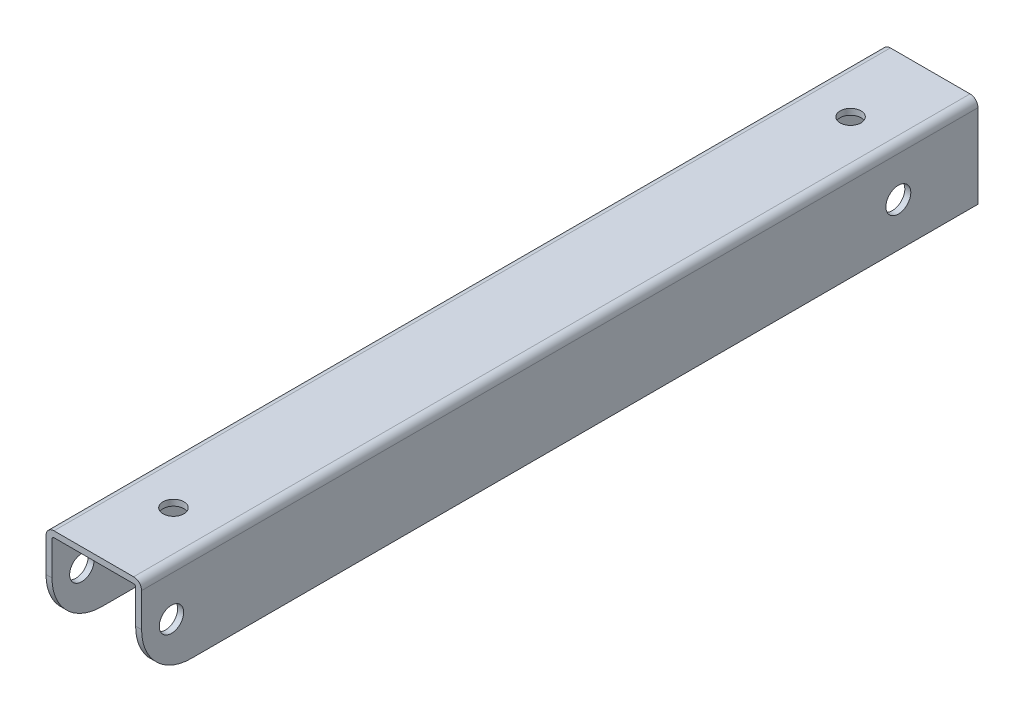
ISO-10303-21;
HEADER;
FILE_DESCRIPTION(('STEP AP214'),'2;1');
FILE_NAME('part.step','',(''),(''),'','','');
FILE_SCHEMA(('AUTOMOTIVE_DESIGN { 1 0 10303 214 1 1 1 1 }'));
ENDSEC;
DATA;
#1=APPLICATION_CONTEXT('core data for automotive mechanical design processes');
#2=APPLICATION_PROTOCOL_DEFINITION('international standard','automotive_design',2000,#1);
#3=PRODUCT_CONTEXT('',#1,'mechanical');
#4=PRODUCT('Part','Part','',(#3));
#5=PRODUCT_RELATED_PRODUCT_CATEGORY('part','',(#4));
#6=PRODUCT_DEFINITION_FORMATION('','',#4);
#7=PRODUCT_DEFINITION_CONTEXT('part definition',#1,'design');
#8=PRODUCT_DEFINITION('design','',#6,#7);
#9=PRODUCT_DEFINITION_SHAPE('','',#8);
#10=(LENGTH_UNIT() NAMED_UNIT(*) SI_UNIT(.MILLI.,.METRE.));
#11=(NAMED_UNIT(*) PLANE_ANGLE_UNIT() SI_UNIT($,.RADIAN.));
#12=(NAMED_UNIT(*) SI_UNIT($,.STERADIAN.) SOLID_ANGLE_UNIT());
#13=UNCERTAINTY_MEASURE_WITH_UNIT(LENGTH_MEASURE(1.E-05),#10,'distance_accuracy_value','');
#14=(GEOMETRIC_REPRESENTATION_CONTEXT(3) GLOBAL_UNCERTAINTY_ASSIGNED_CONTEXT((#13)) GLOBAL_UNIT_ASSIGNED_CONTEXT((#10,
#11,#12)) REPRESENTATION_CONTEXT('',''));
#15=CARTESIAN_POINT('',(0.,0.,0.));
#16=DIRECTION('',(0.,0.,1.));
#17=DIRECTION('',(1.,0.,0.));
#18=AXIS2_PLACEMENT_3D('',#15,#16,#17);
#19=CARTESIAN_POINT('',(-40.044551645857,40.375,420.));
#20=DIRECTION('',(1.,0.,0.));
#21=DIRECTION('',(0.,1.,0.));
#22=AXIS2_PLACEMENT_3D('',#19,#20,#21);
#23=PLANE('',#22);
#24=CARTESIAN_POINT('',(-40.0445516458568,20.375,405.));
#25=DIRECTION('',(-1.,0.,0.));
#26=DIRECTION('',(0.,0.,1.));
#27=AXIS2_PLACEMENT_3D('',#24,#25,#26);
#28=CIRCLE('',#27,6.12499999999999);
#29=CARTESIAN_POINT('',(-40.0445516458568,20.375,411.125));
#30=VERTEX_POINT('',#29);
#31=EDGE_CURVE('E404',#30,#30,#28,.T.);
#32=ORIENTED_EDGE('',*,*,#31,.F.);
#33=EDGE_LOOP('',(#32));
#34=FACE_BOUND('',#33,.T.);
#35=CARTESIAN_POINT('',(-40.0445516458568,20.375,40.));
#36=DIRECTION('',(-1.,0.,0.));
#37=DIRECTION('',(0.,0.,1.));
#38=AXIS2_PLACEMENT_3D('',#35,#36,#37);
#39=CIRCLE('',#38,6.25);
#40=CARTESIAN_POINT('',(-40.0445516458568,20.375,46.25));
#41=VERTEX_POINT('',#40);
#42=EDGE_CURVE('E420',#41,#41,#39,.T.);
#43=ORIENTED_EDGE('',*,*,#42,.F.);
#44=EDGE_LOOP('',(#43));
#45=FACE_BOUND('',#44,.T.);
#46=DIRECTION('',(0.,0.,-1.));
#47=VECTOR('',#46,1.);
#48=CARTESIAN_POINT('',(-40.0445516458566,-1.62500000000004,420.));
#49=LINE('',#48,#47);
#50=CARTESIAN_POINT('',(-40.0445516458566,-1.62500000000004,395.));
#51=VERTEX_POINT('',#50);
#52=CARTESIAN_POINT('',(-40.0445516458566,-1.62500000000004,0.));
#53=VERTEX_POINT('',#52);
#54=EDGE_CURVE('E265',#51,#53,#49,.T.);
#55=ORIENTED_EDGE('',*,*,#54,.F.);
#56=CARTESIAN_POINT('',(-40.0445516458568,23.375,395.));
#57=DIRECTION('',(1.,0.,0.));
#58=DIRECTION('',(0.,1.,0.));
#59=AXIS2_PLACEMENT_3D('',#56,#57,#58);
#60=CIRCLE('',#59,25.);
#61=CARTESIAN_POINT('',(-40.0445516458568,23.375,420.));
#62=VERTEX_POINT('',#61);
#63=EDGE_CURVE('E272',#51,#62,#60,.F.);
#64=ORIENTED_EDGE('',*,*,#63,.T.);
#65=DIRECTION('',(0.,-1.,0.));
#66=VECTOR('',#65,1.);
#67=CARTESIAN_POINT('',(-40.044551645857,40.375,420.));
#68=LINE('',#67,#66);
#69=CARTESIAN_POINT('',(-40.044551645857,40.375,420.));
#70=VERTEX_POINT('',#69);
#71=EDGE_CURVE('E162',#70,#62,#68,.T.);
#72=ORIENTED_EDGE('',*,*,#71,.F.);
#73=DIRECTION('',(0.,0.,-1.));
#74=VECTOR('',#73,1.);
#75=CARTESIAN_POINT('',(-40.044551645857,40.375,420.));
#76=LINE('',#75,#74);
#77=CARTESIAN_POINT('',(-40.044551645857,40.375,0.));
#78=VERTEX_POINT('',#77);
#79=EDGE_CURVE('E191',#70,#78,#76,.T.);
#80=ORIENTED_EDGE('',*,*,#79,.T.);
#81=DIRECTION('',(0.,-1.,0.));
#82=VECTOR('',#81,1.);
#83=CARTESIAN_POINT('',(-40.044551645857,40.375,0.));
#84=LINE('',#83,#82);
#85=EDGE_CURVE('E192',#78,#53,#84,.T.);
#86=ORIENTED_EDGE('',*,*,#85,.T.);
#87=EDGE_LOOP('',(#55,#64,#72,#80,#86));
#88=FACE_BOUND('',#87,.T.);
#89=ADVANCED_FACE('F38',(#34,#45,#88),#23,.F.);
#90=CARTESIAN_POINT('',(-37.0445516458566,-1.62500000000001,420.));
#91=DIRECTION('',(0.,-1.,0.));
#92=DIRECTION('',(1.,0.,0.));
#93=AXIS2_PLACEMENT_3D('',#90,#91,#92);
#94=PLANE('',#93);
#95=DIRECTION('',(0.,0.,-1.));
#96=VECTOR('',#95,1.);
#97=CARTESIAN_POINT('',(-37.0445516458566,-1.62500000000001,420.));
#98=LINE('',#97,#96);
#99=CARTESIAN_POINT('',(-37.0445516458566,-1.62500000000001,395.));
#100=VERTEX_POINT('',#99);
#101=CARTESIAN_POINT('',(-37.0445516458566,-1.62500000000001,0.));
#102=VERTEX_POINT('',#101);
#103=EDGE_CURVE('E150',#100,#102,#98,.T.);
#104=ORIENTED_EDGE('',*,*,#103,.F.);
#105=DIRECTION('',(-1.,0.,0.));
#106=VECTOR('',#105,1.);
#107=CARTESIAN_POINT('',(-37.0445516458566,-1.62500000000001,395.));
#108=LINE('',#107,#106);
#109=EDGE_CURVE('E268',#100,#51,#108,.T.);
#110=ORIENTED_EDGE('',*,*,#109,.T.);
#111=ORIENTED_EDGE('',*,*,#54,.T.);
#112=DIRECTION('',(-1.,0.,0.));
#113=VECTOR('',#112,1.);
#114=CARTESIAN_POINT('',(-37.0445516458566,-1.62500000000001,0.));
#115=LINE('',#114,#113);
#116=EDGE_CURVE('E196',#102,#53,#115,.T.);
#117=ORIENTED_EDGE('',*,*,#116,.F.);
#118=EDGE_LOOP('',(#104,#110,#111,#117));
#119=FACE_BOUND('',#118,.T.);
#120=ADVANCED_FACE('F320',(#119),#94,.T.);
#121=CARTESIAN_POINT('',(-37.044551645857,40.375,420.));
#122=DIRECTION('',(1.,0.,0.));
#123=DIRECTION('',(0.,1.,0.));
#124=AXIS2_PLACEMENT_3D('',#121,#122,#123);
#125=PLANE('',#124);
#126=CARTESIAN_POINT('',(-37.0445516458568,20.375,405.));
#127=DIRECTION('',(1.,0.,0.));
#128=DIRECTION('',(0.,1.,0.));
#129=AXIS2_PLACEMENT_3D('',#126,#127,#128);
#130=CIRCLE('',#129,6.12499999999999);
#131=CARTESIAN_POINT('',(-37.0445516458568,26.4999999999999,405.));
#132=VERTEX_POINT('',#131);
#133=EDGE_CURVE('E416',#132,#132,#130,.T.);
#134=ORIENTED_EDGE('',*,*,#133,.F.);
#135=EDGE_LOOP('',(#134));
#136=FACE_BOUND('',#135,.T.);
#137=CARTESIAN_POINT('',(-37.0445516458568,20.375,40.));
#138=DIRECTION('',(1.,0.,0.));
#139=DIRECTION('',(0.,1.,0.));
#140=AXIS2_PLACEMENT_3D('',#137,#138,#139);
#141=CIRCLE('',#140,6.24999999999999);
#142=CARTESIAN_POINT('',(-37.0445516458568,26.6249999999999,40.));
#143=VERTEX_POINT('',#142);
#144=EDGE_CURVE('E428',#143,#143,#141,.T.);
#145=ORIENTED_EDGE('',*,*,#144,.F.);
#146=EDGE_LOOP('',(#145));
#147=FACE_BOUND('',#146,.T.);
#148=DIRECTION('',(0.,-1.,0.));
#149=VECTOR('',#148,1.);
#150=CARTESIAN_POINT('',(-37.044551645857,40.375,420.));
#151=LINE('',#150,#149);
#152=CARTESIAN_POINT('',(-37.044551645857,40.375,420.));
#153=VERTEX_POINT('',#152);
#154=CARTESIAN_POINT('',(-37.0445516458568,23.375,420.));
#155=VERTEX_POINT('',#154);
#156=EDGE_CURVE('E141',#153,#155,#151,.T.);
#157=ORIENTED_EDGE('',*,*,#156,.T.);
#158=CARTESIAN_POINT('',(-37.0445516458568,23.375,395.));
#159=DIRECTION('',(1.,0.,0.));
#160=DIRECTION('',(0.,1.,0.));
#161=AXIS2_PLACEMENT_3D('',#158,#159,#160);
#162=CIRCLE('',#161,25.);
#163=EDGE_CURVE('E277',#155,#100,#162,.T.);
#164=ORIENTED_EDGE('',*,*,#163,.T.);
#165=ORIENTED_EDGE('',*,*,#103,.T.);
#166=DIRECTION('',(0.,-1.,0.));
#167=VECTOR('',#166,1.);
#168=CARTESIAN_POINT('',(-37.044551645857,40.375,0.));
#169=LINE('',#168,#167);
#170=CARTESIAN_POINT('',(-37.044551645857,40.375,0.));
#171=VERTEX_POINT('',#170);
#172=EDGE_CURVE('E144',#171,#102,#169,.T.);
#173=ORIENTED_EDGE('',*,*,#172,.F.);
#174=DIRECTION('',(0.,0.,-1.));
#175=VECTOR('',#174,1.);
#176=CARTESIAN_POINT('',(-37.044551645857,40.375,420.));
#177=LINE('',#176,#175);
#178=EDGE_CURVE('E138',#153,#171,#177,.T.);
#179=ORIENTED_EDGE('',*,*,#178,.F.);
#180=EDGE_LOOP('',(#157,#164,#165,#173,#179));
#181=FACE_BOUND('',#180,.T.);
#182=ADVANCED_FACE('F140',(#136,#147,#181),#125,.T.);
#183=CARTESIAN_POINT('',(-36.044551645857,40.375,420.));
#184=DIRECTION('',(0.,0.,-1.));
#185=DIRECTION('',(-1.,0.,0.));
#186=AXIS2_PLACEMENT_3D('',#183,#184,#185);
#187=CYLINDRICAL_SURFACE('',#186,1.);
#188=CARTESIAN_POINT('',(-36.044551645857,40.375,0.));
#189=DIRECTION('',(0.,0.,1.));
#190=DIRECTION('',(1.,0.,0.));
#191=AXIS2_PLACEMENT_3D('',#188,#189,#190);
#192=CIRCLE('',#191,1.);
#193=CARTESIAN_POINT('',(-36.044551645857,41.375,0.));
#194=VERTEX_POINT('',#193);
#195=EDGE_CURVE('E203',#194,#171,#192,.T.);
#196=ORIENTED_EDGE('',*,*,#195,.F.);
#197=DIRECTION('',(0.,0.,-1.));
#198=VECTOR('',#197,1.);
#199=CARTESIAN_POINT('',(-36.044551645857,41.375,420.));
#200=LINE('',#199,#198);
#201=CARTESIAN_POINT('',(-36.044551645857,41.375,420.));
#202=VERTEX_POINT('',#201);
#203=EDGE_CURVE('E151',#202,#194,#200,.T.);
#204=ORIENTED_EDGE('',*,*,#203,.F.);
#205=CARTESIAN_POINT('',(-36.044551645857,40.375,420.));
#206=DIRECTION('',(0.,0.,1.));
#207=DIRECTION('',(1.,0.,0.));
#208=AXIS2_PLACEMENT_3D('',#205,#206,#207);
#209=CIRCLE('',#208,1.);
#210=EDGE_CURVE('E156',#202,#153,#209,.T.);
#211=ORIENTED_EDGE('',*,*,#210,.T.);
#212=ORIENTED_EDGE('',*,*,#178,.T.);
#213=EDGE_LOOP('',(#196,#204,#211,#212));
#214=FACE_BOUND('',#213,.T.);
#215=ADVANCED_FACE('F164',(#214),#187,.F.);
#216=CARTESIAN_POINT('',(-36.044551645857,41.375,420.));
#217=DIRECTION('',(0.,-1.,0.));
#218=DIRECTION('',(0.,0.,-1.));
#219=AXIS2_PLACEMENT_3D('',#216,#217,#218);
#220=PLANE('',#219);
#221=CARTESIAN_POINT('',(-16.044551645857,41.375,380.));
#222=DIRECTION('',(0.,-1.,0.));
#223=DIRECTION('',(0.,0.,-1.));
#224=AXIS2_PLACEMENT_3D('',#221,#222,#223);
#225=CIRCLE('',#224,5.24999999999999);
#226=CARTESIAN_POINT('',(-16.044551645857,41.375,374.75));
#227=VERTEX_POINT('',#226);
#228=EDGE_CURVE('E387',#227,#227,#225,.T.);
#229=ORIENTED_EDGE('',*,*,#228,.F.);
#230=EDGE_LOOP('',(#229));
#231=FACE_BOUND('',#230,.T.);
#232=CARTESIAN_POINT('',(-16.044551645857,41.375,40.));
#233=DIRECTION('',(0.,-1.,0.));
#234=DIRECTION('',(0.,0.,-1.));
#235=AXIS2_PLACEMENT_3D('',#232,#233,#234);
#236=CIRCLE('',#235,5.24999999999999);
#237=CARTESIAN_POINT('',(-16.044551645857,41.375,34.75));
#238=VERTEX_POINT('',#237);
#239=EDGE_CURVE('E400',#238,#238,#236,.T.);
#240=ORIENTED_EDGE('',*,*,#239,.F.);
#241=EDGE_LOOP('',(#240));
#242=FACE_BOUND('',#241,.T.);
#243=DIRECTION('',(-1.,0.,0.));
#244=VECTOR('',#243,1.);
#245=CARTESIAN_POINT('',(-36.044551645857,41.375,0.));
#246=LINE('',#245,#244);
#247=CARTESIAN_POINT('',(3.95544835414302,41.375,0.));
#248=VERTEX_POINT('',#247);
#249=EDGE_CURVE('E206',#248,#194,#246,.T.);
#250=ORIENTED_EDGE('',*,*,#249,.F.);
#251=DIRECTION('',(0.,0.,-1.));
#252=VECTOR('',#251,1.);
#253=CARTESIAN_POINT('',(3.95544835414302,41.375,420.));
#254=LINE('',#253,#252);
#255=CARTESIAN_POINT('',(3.95544835414302,41.375,420.));
#256=VERTEX_POINT('',#255);
#257=EDGE_CURVE('E258',#256,#248,#254,.T.);
#258=ORIENTED_EDGE('',*,*,#257,.F.);
#259=DIRECTION('',(-1.,0.,0.));
#260=VECTOR('',#259,1.);
#261=CARTESIAN_POINT('',(-36.044551645857,41.375,420.));
#262=LINE('',#261,#260);
#263=EDGE_CURVE('E166',#256,#202,#262,.T.);
#264=ORIENTED_EDGE('',*,*,#263,.T.);
#265=ORIENTED_EDGE('',*,*,#203,.T.);
#266=EDGE_LOOP('',(#250,#258,#264,#265));
#267=FACE_BOUND('',#266,.T.);
#268=ADVANCED_FACE('F337',(#231,#242,#267),#220,.T.);
#269=CARTESIAN_POINT('',(3.95544835414302,40.375,420.));
#270=DIRECTION('',(0.,0.,-1.));
#271=DIRECTION('',(-1.,0.,0.));
#272=AXIS2_PLACEMENT_3D('',#269,#270,#271);
#273=CYLINDRICAL_SURFACE('',#272,1.);
#274=CARTESIAN_POINT('',(3.95544835414302,40.375,0.));
#275=DIRECTION('',(0.,0.,1.));
#276=DIRECTION('',(-1.,0.,0.));
#277=AXIS2_PLACEMENT_3D('',#274,#275,#276);
#278=CIRCLE('',#277,1.);
#279=CARTESIAN_POINT('',(4.95544835414302,40.375,0.));
#280=VERTEX_POINT('',#279);
#281=EDGE_CURVE('E210',#280,#248,#278,.T.);
#282=ORIENTED_EDGE('',*,*,#281,.F.);
#283=DIRECTION('',(0.,0.,-1.));
#284=VECTOR('',#283,1.);
#285=CARTESIAN_POINT('',(4.95544835414302,40.375,420.));
#286=LINE('',#285,#284);
#287=CARTESIAN_POINT('',(4.95544835414302,40.375,420.));
#288=VERTEX_POINT('',#287);
#289=EDGE_CURVE('E255',#288,#280,#286,.T.);
#290=ORIENTED_EDGE('',*,*,#289,.F.);
#291=CARTESIAN_POINT('',(3.95544835414302,40.375,420.));
#292=DIRECTION('',(0.,0.,1.));
#293=DIRECTION('',(-1.,0.,0.));
#294=AXIS2_PLACEMENT_3D('',#291,#292,#293);
#295=CIRCLE('',#294,1.);
#296=EDGE_CURVE('E169',#288,#256,#295,.T.);
#297=ORIENTED_EDGE('',*,*,#296,.T.);
#298=ORIENTED_EDGE('',*,*,#257,.T.);
#299=EDGE_LOOP('',(#282,#290,#297,#298));
#300=FACE_BOUND('',#299,.T.);
#301=ADVANCED_FACE('F340',(#300),#273,.F.);
#302=CARTESIAN_POINT('',(4.95544835414302,-1.62500000000002,420.));
#303=DIRECTION('',(-1.,0.,0.));
#304=DIRECTION('',(0.,0.,1.));
#305=AXIS2_PLACEMENT_3D('',#302,#303,#304);
#306=PLANE('',#305);
#307=CARTESIAN_POINT('',(4.95544835414302,20.375,405.));
#308=DIRECTION('',(-1.,0.,0.));
#309=DIRECTION('',(0.,0.,1.));
#310=AXIS2_PLACEMENT_3D('',#307,#308,#309);
#311=CIRCLE('',#310,6.12499999999999);
#312=CARTESIAN_POINT('',(4.95544835414302,20.375,411.125));
#313=VERTEX_POINT('',#312);
#314=EDGE_CURVE('E412',#313,#313,#311,.T.);
#315=ORIENTED_EDGE('',*,*,#314,.F.);
#316=EDGE_LOOP('',(#315));
#317=FACE_BOUND('',#316,.T.);
#318=CARTESIAN_POINT('',(4.95544835414302,20.375,40.));
#319=DIRECTION('',(-1.,0.,0.));
#320=DIRECTION('',(0.,0.,1.));
#321=AXIS2_PLACEMENT_3D('',#318,#319,#320);
#322=CIRCLE('',#321,6.24999999999999);
#323=CARTESIAN_POINT('',(4.95544835414302,20.375,46.25));
#324=VERTEX_POINT('',#323);
#325=EDGE_CURVE('E197',#324,#324,#322,.T.);
#326=ORIENTED_EDGE('',*,*,#325,.F.);
#327=EDGE_LOOP('',(#326));
#328=FACE_BOUND('',#327,.T.);
#329=DIRECTION('',(0.,0.,-1.));
#330=VECTOR('',#329,1.);
#331=CARTESIAN_POINT('',(4.95544835414302,-1.62500000000002,420.));
#332=LINE('',#331,#330);
#333=CARTESIAN_POINT('',(4.95544835414302,-1.62500000000002,395.));
#334=VERTEX_POINT('',#333);
#335=CARTESIAN_POINT('',(4.95544835414302,-1.62500000000002,0.));
#336=VERTEX_POINT('',#335);
#337=EDGE_CURVE('E252',#334,#336,#332,.T.);
#338=ORIENTED_EDGE('',*,*,#337,.F.);
#339=CARTESIAN_POINT('',(4.95544835414302,23.375,395.));
#340=DIRECTION('',(-1.,0.,0.));
#341=DIRECTION('',(0.,0.,1.));
#342=AXIS2_PLACEMENT_3D('',#339,#340,#341);
#343=CIRCLE('',#342,25.);
#344=CARTESIAN_POINT('',(4.95544835414302,23.375,420.));
#345=VERTEX_POINT('',#344);
#346=EDGE_CURVE('E61',#334,#345,#343,.T.);
#347=ORIENTED_EDGE('',*,*,#346,.T.);
#348=DIRECTION('',(0.,1.,0.));
#349=VECTOR('',#348,1.);
#350=CARTESIAN_POINT('',(4.95544835414302,-1.62500000000002,420.));
#351=LINE('',#350,#349);
#352=EDGE_CURVE('E176',#345,#288,#351,.T.);
#353=ORIENTED_EDGE('',*,*,#352,.T.);
#354=ORIENTED_EDGE('',*,*,#289,.T.);
#355=DIRECTION('',(0.,1.,0.));
#356=VECTOR('',#355,1.);
#357=CARTESIAN_POINT('',(4.95544835414302,-1.62500000000002,0.));
#358=LINE('',#357,#356);
#359=EDGE_CURVE('E214',#336,#280,#358,.T.);
#360=ORIENTED_EDGE('',*,*,#359,.F.);
#361=EDGE_LOOP('',(#338,#347,#353,#354,#360));
#362=FACE_BOUND('',#361,.T.);
#363=ADVANCED_FACE('F294',(#317,#328,#362),#306,.T.);
#364=CARTESIAN_POINT('',(7.95544835414302,-1.62500000000002,420.));
#365=DIRECTION('',(0.,-1.,0.));
#366=DIRECTION('',(0.,0.,-1.));
#367=AXIS2_PLACEMENT_3D('',#364,#365,#366);
#368=PLANE('',#367);
#369=DIRECTION('',(0.,0.,-1.));
#370=VECTOR('',#369,1.);
#371=CARTESIAN_POINT('',(7.95544835414302,-1.62500000000002,420.));
#372=LINE('',#371,#370);
#373=CARTESIAN_POINT('',(7.95544835414302,-1.62500000000002,395.));
#374=VERTEX_POINT('',#373);
#375=CARTESIAN_POINT('',(7.95544835414302,-1.62500000000002,0.));
#376=VERTEX_POINT('',#375);
#377=EDGE_CURVE('E249',#374,#376,#372,.T.);
#378=ORIENTED_EDGE('',*,*,#377,.F.);
#379=DIRECTION('',(-1.,0.,0.));
#380=VECTOR('',#379,1.);
#381=CARTESIAN_POINT('',(7.95544835414302,-1.62500000000002,395.));
#382=LINE('',#381,#380);
#383=EDGE_CURVE('E280',#374,#334,#382,.T.);
#384=ORIENTED_EDGE('',*,*,#383,.T.);
#385=ORIENTED_EDGE('',*,*,#337,.T.);
#386=DIRECTION('',(-1.,0.,0.));
#387=VECTOR('',#386,1.);
#388=CARTESIAN_POINT('',(7.95544835414302,-1.62500000000002,0.));
#389=LINE('',#388,#387);
#390=EDGE_CURVE('E218',#376,#336,#389,.T.);
#391=ORIENTED_EDGE('',*,*,#390,.F.);
#392=EDGE_LOOP('',(#378,#384,#385,#391));
#393=FACE_BOUND('',#392,.T.);
#394=ADVANCED_FACE('F289',(#393),#368,.T.);
#395=CARTESIAN_POINT('',(7.95544835414302,-1.62500000000002,420.));
#396=DIRECTION('',(-1.,0.,0.));
#397=DIRECTION('',(0.,0.,1.));
#398=AXIS2_PLACEMENT_3D('',#395,#396,#397);
#399=PLANE('',#398);
#400=CARTESIAN_POINT('',(7.95544835414349,20.375,405.));
#401=DIRECTION('',(-1.,0.,0.));
#402=DIRECTION('',(0.,0.,1.));
#403=AXIS2_PLACEMENT_3D('',#400,#401,#402);
#404=CIRCLE('',#403,6.12499999999999);
#405=CARTESIAN_POINT('',(7.95544835414349,20.375,411.125));
#406=VERTEX_POINT('',#405);
#407=EDGE_CURVE('E408',#406,#406,#404,.T.);
#408=ORIENTED_EDGE('',*,*,#407,.T.);
#409=EDGE_LOOP('',(#408));
#410=FACE_BOUND('',#409,.T.);
#411=CARTESIAN_POINT('',(7.95544835414322,20.375,40.));
#412=DIRECTION('',(-1.,0.,0.));
#413=DIRECTION('',(0.,0.,1.));
#414=AXIS2_PLACEMENT_3D('',#411,#412,#413);
#415=CIRCLE('',#414,6.24999999999999);
#416=CARTESIAN_POINT('',(7.95544835414322,20.375,46.25));
#417=VERTEX_POINT('',#416);
#418=EDGE_CURVE('E424',#417,#417,#415,.T.);
#419=ORIENTED_EDGE('',*,*,#418,.T.);
#420=EDGE_LOOP('',(#419));
#421=FACE_BOUND('',#420,.T.);
#422=DIRECTION('',(0.,1.,0.));
#423=VECTOR('',#422,1.);
#424=CARTESIAN_POINT('',(7.95544835414302,-1.62500000000002,420.));
#425=LINE('',#424,#423);
#426=CARTESIAN_POINT('',(7.95544835414302,23.375,420.));
#427=VERTEX_POINT('',#426);
#428=CARTESIAN_POINT('',(7.95544835414302,40.375,420.));
#429=VERTEX_POINT('',#428);
#430=EDGE_CURVE('E179',#427,#429,#425,.T.);
#431=ORIENTED_EDGE('',*,*,#430,.F.);
#432=CARTESIAN_POINT('',(7.95544835414302,23.375,395.));
#433=DIRECTION('',(-1.,0.,0.));
#434=DIRECTION('',(0.,0.,1.));
#435=AXIS2_PLACEMENT_3D('',#432,#433,#434);
#436=CIRCLE('',#435,25.);
#437=EDGE_CURVE('E11',#427,#374,#436,.F.);
#438=ORIENTED_EDGE('',*,*,#437,.T.);
#439=ORIENTED_EDGE('',*,*,#377,.T.);
#440=DIRECTION('',(0.,1.,0.));
#441=VECTOR('',#440,1.);
#442=CARTESIAN_POINT('',(7.95544835414302,-1.62500000000002,0.));
#443=LINE('',#442,#441);
#444=CARTESIAN_POINT('',(7.95544835414302,40.375,0.));
#445=VERTEX_POINT('',#444);
#446=EDGE_CURVE('E222',#376,#445,#443,.T.);
#447=ORIENTED_EDGE('',*,*,#446,.T.);
#448=DIRECTION('',(0.,0.,-1.));
#449=VECTOR('',#448,1.);
#450=CARTESIAN_POINT('',(7.95544835414302,40.375,420.));
#451=LINE('',#450,#449);
#452=EDGE_CURVE('E245',#429,#445,#451,.T.);
#453=ORIENTED_EDGE('',*,*,#452,.F.);
#454=EDGE_LOOP('',(#431,#438,#439,#447,#453));
#455=FACE_BOUND('',#454,.T.);
#456=ADVANCED_FACE('F305',(#410,#421,#455),#399,.F.);
#457=CARTESIAN_POINT('',(3.95544835414302,40.375,420.));
#458=DIRECTION('',(0.,0.,-1.));
#459=DIRECTION('',(-1.,0.,0.));
#460=AXIS2_PLACEMENT_3D('',#457,#458,#459);
#461=CYLINDRICAL_SURFACE('',#460,4.);
#462=CARTESIAN_POINT('',(3.95544835414302,40.375,0.));
#463=DIRECTION('',(0.,0.,1.));
#464=DIRECTION('',(1.,0.,0.));
#465=AXIS2_PLACEMENT_3D('',#462,#463,#464);
#466=CIRCLE('',#465,4.);
#467=CARTESIAN_POINT('',(3.95544835414302,44.375,0.));
#468=VERTEX_POINT('',#467);
#469=EDGE_CURVE('E225',#445,#468,#466,.T.);
#470=ORIENTED_EDGE('',*,*,#469,.T.);
#471=DIRECTION('',(0.,0.,-1.));
#472=VECTOR('',#471,1.);
#473=CARTESIAN_POINT('',(3.95544835414302,44.375,420.));
#474=LINE('',#473,#472);
#475=CARTESIAN_POINT('',(3.95544835414302,44.375,420.));
#476=VERTEX_POINT('',#475);
#477=EDGE_CURVE('E241',#476,#468,#474,.T.);
#478=ORIENTED_EDGE('',*,*,#477,.F.);
#479=CARTESIAN_POINT('',(3.95544835414302,40.375,420.));
#480=DIRECTION('',(0.,0.,1.));
#481=DIRECTION('',(1.,0.,0.));
#482=AXIS2_PLACEMENT_3D('',#479,#480,#481);
#483=CIRCLE('',#482,4.);
#484=EDGE_CURVE('E182',#429,#476,#483,.T.);
#485=ORIENTED_EDGE('',*,*,#484,.F.);
#486=ORIENTED_EDGE('',*,*,#452,.T.);
#487=EDGE_LOOP('',(#470,#478,#485,#486));
#488=FACE_BOUND('',#487,.T.);
#489=ADVANCED_FACE('F308',(#488),#461,.T.);
#490=CARTESIAN_POINT('',(-36.044551645857,44.375,420.));
#491=DIRECTION('',(0.,-1.,0.));
#492=DIRECTION('',(0.,0.,-1.));
#493=AXIS2_PLACEMENT_3D('',#490,#491,#492);
#494=PLANE('',#493);
#495=CARTESIAN_POINT('',(-16.044551645857,44.375,380.));
#496=DIRECTION('',(0.,1.,0.));
#497=DIRECTION('',(0.,0.,1.));
#498=AXIS2_PLACEMENT_3D('',#495,#496,#497);
#499=CIRCLE('',#498,5.24999999999999);
#500=CARTESIAN_POINT('',(-16.044551645857,44.375,385.25));
#501=VERTEX_POINT('',#500);
#502=EDGE_CURVE('E390',#501,#501,#499,.T.);
#503=ORIENTED_EDGE('',*,*,#502,.F.);
#504=EDGE_LOOP('',(#503));
#505=FACE_BOUND('',#504,.T.);
#506=CARTESIAN_POINT('',(-16.044551645857,44.375,40.));
#507=DIRECTION('',(0.,1.,0.));
#508=DIRECTION('',(0.,0.,1.));
#509=AXIS2_PLACEMENT_3D('',#506,#507,#508);
#510=CIRCLE('',#509,5.24999999999999);
#511=CARTESIAN_POINT('',(-16.044551645857,44.375,45.25));
#512=VERTEX_POINT('',#511);
#513=EDGE_CURVE('E394',#512,#512,#510,.T.);
#514=ORIENTED_EDGE('',*,*,#513,.F.);
#515=EDGE_LOOP('',(#514));
#516=FACE_BOUND('',#515,.T.);
#517=DIRECTION('',(1.,0.,0.));
#518=VECTOR('',#517,1.);
#519=CARTESIAN_POINT('',(-36.044551645857,44.375,0.));
#520=LINE('',#519,#518);
#521=CARTESIAN_POINT('',(-36.044551645857,44.375,0.));
#522=VERTEX_POINT('',#521);
#523=EDGE_CURVE('E228',#468,#522,#520,.F.);
#524=ORIENTED_EDGE('',*,*,#523,.T.);
#525=DIRECTION('',(0.,0.,-1.));
#526=VECTOR('',#525,1.);
#527=CARTESIAN_POINT('',(-36.044551645857,44.375,420.));
#528=LINE('',#527,#526);
#529=CARTESIAN_POINT('',(-36.044551645857,44.375,420.));
#530=VERTEX_POINT('',#529);
#531=EDGE_CURVE('E237',#530,#522,#528,.T.);
#532=ORIENTED_EDGE('',*,*,#531,.F.);
#533=DIRECTION('',(1.,0.,0.));
#534=VECTOR('',#533,1.);
#535=CARTESIAN_POINT('',(-36.044551645857,44.375,420.));
#536=LINE('',#535,#534);
#537=EDGE_CURVE('E185',#476,#530,#536,.F.);
#538=ORIENTED_EDGE('',*,*,#537,.F.);
#539=ORIENTED_EDGE('',*,*,#477,.T.);
#540=EDGE_LOOP('',(#524,#532,#538,#539));
#541=FACE_BOUND('',#540,.T.);
#542=ADVANCED_FACE('F355',(#505,#516,#541),#494,.F.);
#543=CARTESIAN_POINT('',(-36.044551645857,40.375,420.));
#544=DIRECTION('',(0.,0.,-1.));
#545=DIRECTION('',(-1.,0.,0.));
#546=AXIS2_PLACEMENT_3D('',#543,#544,#545);
#547=CYLINDRICAL_SURFACE('',#546,4.);
#548=CARTESIAN_POINT('',(-36.044551645857,40.375,0.));
#549=DIRECTION('',(0.,0.,1.));
#550=DIRECTION('',(1.,0.,0.));
#551=AXIS2_PLACEMENT_3D('',#548,#549,#550);
#552=CIRCLE('',#551,4.);
#553=EDGE_CURVE('E231',#522,#78,#552,.T.);
#554=ORIENTED_EDGE('',*,*,#553,.T.);
#555=ORIENTED_EDGE('',*,*,#79,.F.);
#556=CARTESIAN_POINT('',(-36.044551645857,40.375,420.));
#557=DIRECTION('',(0.,0.,1.));
#558=DIRECTION('',(1.,0.,0.));
#559=AXIS2_PLACEMENT_3D('',#556,#557,#558);
#560=CIRCLE('',#559,4.);
#561=EDGE_CURVE('E188',#530,#70,#560,.T.);
#562=ORIENTED_EDGE('',*,*,#561,.F.);
#563=ORIENTED_EDGE('',*,*,#531,.T.);
#564=EDGE_LOOP('',(#554,#555,#562,#563));
#565=FACE_BOUND('',#564,.T.);
#566=ADVANCED_FACE('F358',(#565),#547,.T.);
#567=CARTESIAN_POINT('',(-36.044551645857,40.375,420.));
#568=DIRECTION('',(0.,0.,1.));
#569=DIRECTION('',(1.,0.,0.));
#570=AXIS2_PLACEMENT_3D('',#567,#568,#569);
#571=PLANE('',#570);
#572=ORIENTED_EDGE('',*,*,#352,.F.);
#573=DIRECTION('',(-1.,0.,0.));
#574=VECTOR('',#573,1.);
#575=CARTESIAN_POINT('',(-36.044551645857,23.375,420.));
#576=LINE('',#575,#574);
#577=EDGE_CURVE('E47',#345,#427,#576,.F.);
#578=ORIENTED_EDGE('',*,*,#577,.T.);
#579=ORIENTED_EDGE('',*,*,#430,.T.);
#580=ORIENTED_EDGE('',*,*,#484,.T.);
#581=ORIENTED_EDGE('',*,*,#537,.T.);
#582=ORIENTED_EDGE('',*,*,#561,.T.);
#583=ORIENTED_EDGE('',*,*,#71,.T.);
#584=DIRECTION('',(-1.,0.,0.));
#585=VECTOR('',#584,1.);
#586=CARTESIAN_POINT('',(-36.0445516458568,23.375,420.));
#587=LINE('',#586,#585);
#588=EDGE_CURVE('E160',#62,#155,#587,.F.);
#589=ORIENTED_EDGE('',*,*,#588,.T.);
#590=ORIENTED_EDGE('',*,*,#156,.F.);
#591=ORIENTED_EDGE('',*,*,#210,.F.);
#592=ORIENTED_EDGE('',*,*,#263,.F.);
#593=ORIENTED_EDGE('',*,*,#296,.F.);
#594=EDGE_LOOP('',(#572,#578,#579,#580,#581,#582,#583,#589,#590,#591,#592,#593));
#595=FACE_BOUND('',#594,.T.);
#596=ADVANCED_FACE('F154',(#595),#571,.T.);
#597=CARTESIAN_POINT('',(-36.044551645857,40.375,0.));
#598=DIRECTION('',(0.,0.,1.));
#599=DIRECTION('',(1.,0.,0.));
#600=AXIS2_PLACEMENT_3D('',#597,#598,#599);
#601=PLANE('',#600);
#602=ORIENTED_EDGE('',*,*,#85,.F.);
#603=ORIENTED_EDGE('',*,*,#553,.F.);
#604=ORIENTED_EDGE('',*,*,#523,.F.);
#605=ORIENTED_EDGE('',*,*,#469,.F.);
#606=ORIENTED_EDGE('',*,*,#446,.F.);
#607=ORIENTED_EDGE('',*,*,#390,.T.);
#608=ORIENTED_EDGE('',*,*,#359,.T.);
#609=ORIENTED_EDGE('',*,*,#281,.T.);
#610=ORIENTED_EDGE('',*,*,#249,.T.);
#611=ORIENTED_EDGE('',*,*,#195,.T.);
#612=ORIENTED_EDGE('',*,*,#172,.T.);
#613=ORIENTED_EDGE('',*,*,#116,.T.);
#614=EDGE_LOOP('',(#602,#603,#604,#605,#606,#607,#608,#609,#610,#611,#612,#613));
#615=FACE_BOUND('',#614,.T.);
#616=ADVANCED_FACE('F300',(#615),#601,.F.);
#617=CARTESIAN_POINT('',(-40.0445516458568,20.375,40.));
#618=DIRECTION('',(-1.,0.,0.));
#619=DIRECTION('',(0.,0.,1.));
#620=AXIS2_PLACEMENT_3D('',#617,#618,#619);
#621=CYLINDRICAL_SURFACE('',#620,6.24999999999999);
#622=ORIENTED_EDGE('',*,*,#144,.T.);
#623=EDGE_LOOP('',(#622));
#624=FACE_BOUND('',#623,.T.);
#625=ORIENTED_EDGE('',*,*,#42,.T.);
#626=EDGE_LOOP('',(#625));
#627=FACE_BOUND('',#626,.T.);
#628=ADVANCED_FACE('F365',(#624,#627),#621,.F.);
#629=ORIENTED_EDGE('',*,*,#325,.T.);
#630=EDGE_LOOP('',(#629));
#631=FACE_BOUND('',#630,.T.);
#632=ORIENTED_EDGE('',*,*,#418,.F.);
#633=EDGE_LOOP('',(#632));
#634=FACE_BOUND('',#633,.T.);
#635=ADVANCED_FACE('F370',(#631,#634),#621,.F.);
#636=CARTESIAN_POINT('',(-40.0445516458568,20.375,405.));
#637=DIRECTION('',(-1.,0.,0.));
#638=DIRECTION('',(0.,0.,1.));
#639=AXIS2_PLACEMENT_3D('',#636,#637,#638);
#640=CYLINDRICAL_SURFACE('',#639,6.12499999999999);
#641=ORIENTED_EDGE('',*,*,#314,.T.);
#642=EDGE_LOOP('',(#641));
#643=FACE_BOUND('',#642,.T.);
#644=ORIENTED_EDGE('',*,*,#407,.F.);
#645=EDGE_LOOP('',(#644));
#646=FACE_BOUND('',#645,.T.);
#647=ADVANCED_FACE('F372',(#643,#646),#640,.F.);
#648=ORIENTED_EDGE('',*,*,#133,.T.);
#649=EDGE_LOOP('',(#648));
#650=FACE_BOUND('',#649,.T.);
#651=ORIENTED_EDGE('',*,*,#31,.T.);
#652=EDGE_LOOP('',(#651));
#653=FACE_BOUND('',#652,.T.);
#654=ADVANCED_FACE('F375',(#650,#653),#640,.F.);
#655=CARTESIAN_POINT('',(-16.044551645857,44.375,40.));
#656=DIRECTION('',(0.,1.,0.));
#657=DIRECTION('',(0.,0.,1.));
#658=AXIS2_PLACEMENT_3D('',#655,#656,#657);
#659=CYLINDRICAL_SURFACE('',#658,5.24999999999999);
#660=ORIENTED_EDGE('',*,*,#239,.T.);
#661=EDGE_LOOP('',(#660));
#662=FACE_BOUND('',#661,.T.);
#663=ORIENTED_EDGE('',*,*,#513,.T.);
#664=EDGE_LOOP('',(#663));
#665=FACE_BOUND('',#664,.T.);
#666=ADVANCED_FACE('F377',(#662,#665),#659,.F.);
#667=CARTESIAN_POINT('',(-16.044551645857,44.375,380.));
#668=DIRECTION('',(0.,1.,0.));
#669=DIRECTION('',(0.,0.,1.));
#670=AXIS2_PLACEMENT_3D('',#667,#668,#669);
#671=CYLINDRICAL_SURFACE('',#670,5.24999999999999);
#672=ORIENTED_EDGE('',*,*,#228,.T.);
#673=EDGE_LOOP('',(#672));
#674=FACE_BOUND('',#673,.T.);
#675=ORIENTED_EDGE('',*,*,#502,.T.);
#676=EDGE_LOOP('',(#675));
#677=FACE_BOUND('',#676,.T.);
#678=ADVANCED_FACE('F317',(#674,#677),#671,.F.);
#679=CARTESIAN_POINT('',(-37.0445516458568,23.375,395.));
#680=DIRECTION('',(-1.,0.,0.));
#681=DIRECTION('',(0.,-1.,0.));
#682=AXIS2_PLACEMENT_3D('',#679,#680,#681);
#683=CYLINDRICAL_SURFACE('',#682,25.);
#684=ORIENTED_EDGE('',*,*,#163,.F.);
#685=ORIENTED_EDGE('',*,*,#588,.F.);
#686=ORIENTED_EDGE('',*,*,#63,.F.);
#687=ORIENTED_EDGE('',*,*,#109,.F.);
#688=EDGE_LOOP('',(#684,#685,#686,#687));
#689=FACE_BOUND('',#688,.T.);
#690=ADVANCED_FACE('F313',(#689),#683,.T.);
#691=CARTESIAN_POINT('',(7.95544835414302,23.375,395.));
#692=DIRECTION('',(-1.,0.,0.));
#693=DIRECTION('',(0.,0.,1.));
#694=AXIS2_PLACEMENT_3D('',#691,#692,#693);
#695=CYLINDRICAL_SURFACE('',#694,25.);
#696=ORIENTED_EDGE('',*,*,#437,.F.);
#697=ORIENTED_EDGE('',*,*,#577,.F.);
#698=ORIENTED_EDGE('',*,*,#346,.F.);
#699=ORIENTED_EDGE('',*,*,#383,.F.);
#700=EDGE_LOOP('',(#696,#697,#698,#699));
#701=FACE_BOUND('',#700,.T.);
#702=ADVANCED_FACE('F40',(#701),#695,.T.);
#703=CLOSED_SHELL('',(#89,#120,#182,#215,#268,#301,#363,#394,#456,#489,#542,#566,#596,#616,#628,
#635,#647,#654,#666,#678,#690,#702));
#704=MANIFOLD_SOLID_BREP('B2',#703);
#705=ADVANCED_BREP_SHAPE_REPRESENTATION('',(#18,#704),#14);
#706=SHAPE_DEFINITION_REPRESENTATION(#9,#705);
ENDSEC;
END-ISO-10303-21;
